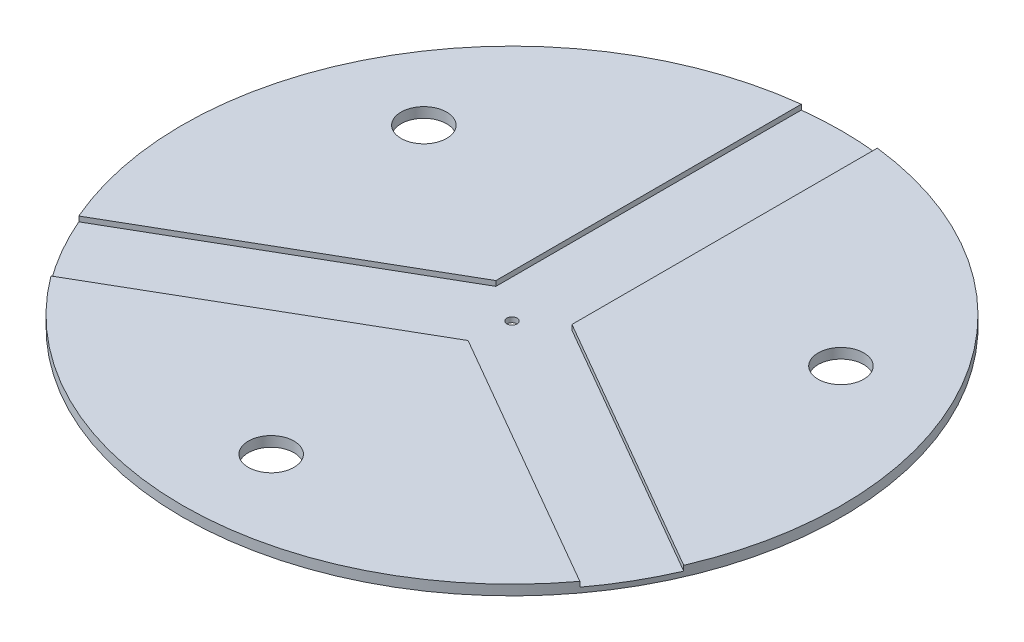
ISO-10303-21;
HEADER;
FILE_DESCRIPTION(('STEP AP214'),'2;1');
FILE_NAME('part.step','',(''),(''),'','','');
FILE_SCHEMA(('AUTOMOTIVE_DESIGN { 1 0 10303 214 1 1 1 1 }'));
ENDSEC;
DATA;
#1=APPLICATION_CONTEXT('core data for automotive mechanical design processes');
#2=APPLICATION_PROTOCOL_DEFINITION('international standard','automotive_design',2000,#1);
#3=PRODUCT_CONTEXT('',#1,'mechanical');
#4=PRODUCT('Part','Part','',(#3));
#5=PRODUCT_RELATED_PRODUCT_CATEGORY('part','',(#4));
#6=PRODUCT_DEFINITION_FORMATION('','',#4);
#7=PRODUCT_DEFINITION_CONTEXT('part definition',#1,'design');
#8=PRODUCT_DEFINITION('design','',#6,#7);
#9=PRODUCT_DEFINITION_SHAPE('','',#8);
#10=(LENGTH_UNIT() NAMED_UNIT(*) SI_UNIT(.MILLI.,.METRE.));
#11=(NAMED_UNIT(*) PLANE_ANGLE_UNIT() SI_UNIT($,.RADIAN.));
#12=(NAMED_UNIT(*) SI_UNIT($,.STERADIAN.) SOLID_ANGLE_UNIT());
#13=UNCERTAINTY_MEASURE_WITH_UNIT(LENGTH_MEASURE(1.E-05),#10,'distance_accuracy_value','');
#14=(GEOMETRIC_REPRESENTATION_CONTEXT(3) GLOBAL_UNCERTAINTY_ASSIGNED_CONTEXT((#13)) GLOBAL_UNIT_ASSIGNED_CONTEXT((#10,
#11,#12)) REPRESENTATION_CONTEXT('',''));
#15=CARTESIAN_POINT('',(0.,0.,0.));
#16=DIRECTION('',(0.,0.,1.));
#17=DIRECTION('',(1.,0.,0.));
#18=AXIS2_PLACEMENT_3D('',#15,#16,#17);
#19=CARTESIAN_POINT('',(0.,1.,0.));
#20=DIRECTION('',(0.,1.,0.));
#21=DIRECTION('',(0.,0.,1.));
#22=AXIS2_PLACEMENT_3D('',#19,#20,#21);
#23=PLANE('',#22);
#24=CARTESIAN_POINT('',(41.1362066797609,1.,-23.7499999999999));
#25=DIRECTION('',(0.,1.,0.));
#26=DIRECTION('',(0.,0.,1.));
#27=AXIS2_PLACEMENT_3D('',#24,#25,#26);
#28=CIRCLE('',#27,4.5);
#29=CARTESIAN_POINT('',(41.1362066797609,1.,-19.2499999999999));
#30=VERTEX_POINT('',#29);
#31=EDGE_CURVE('E146',#30,#30,#28,.T.);
#32=ORIENTED_EDGE('',*,*,#31,.F.);
#33=EDGE_LOOP('',(#32));
#34=FACE_BOUND('',#33,.T.);
#35=DIRECTION('',(0.,0.,-1.));
#36=VECTOR('',#35,1.);
#37=CARTESIAN_POINT('',(7.5,1.,-73.6523444441214));
#38=LINE('',#37,#36);
#39=CARTESIAN_POINT('',(7.50000000000001,1.,-4.33012701892217));
#40=VERTEX_POINT('',#39);
#41=CARTESIAN_POINT('',(7.5,1.,-64.5658578507248));
#42=VERTEX_POINT('',#41);
#43=EDGE_CURVE('E143',#40,#42,#38,.T.);
#44=ORIENTED_EDGE('',*,*,#43,.F.);
#45=DIRECTION('',(-0.866025403784436,0.,-0.500000000000004));
#46=VECTOR('',#45,1.);
#47=CARTESIAN_POINT('',(67.5348013368907,1.,30.3309816936777));
#48=LINE('',#47,#46);
#49=CARTESIAN_POINT('',(59.6656731158625,1.,25.7877383969794));
#50=VERTEX_POINT('',#49);
#51=EDGE_CURVE('E158',#50,#40,#48,.T.);
#52=ORIENTED_EDGE('',*,*,#51,.F.);
#53=CARTESIAN_POINT('',(0.,1.,0.));
#54=DIRECTION('',(0.,1.,0.));
#55=DIRECTION('',(0.,0.,1.));
#56=AXIS2_PLACEMENT_3D('',#53,#54,#55);
#57=CIRCLE('',#56,65.);
#58=EDGE_CURVE('E183',#50,#42,#57,.T.);
#59=ORIENTED_EDGE('',*,*,#58,.T.);
#60=EDGE_LOOP('',(#44,#52,#59));
#61=FACE_BOUND('',#60,.T.);
#62=ADVANCED_FACE('F38',(#34,#61),#23,.T.);
#63=CARTESIAN_POINT('',(2.89815974737969E-12,1.,47.5000000000017));
#64=DIRECTION('',(0.,1.,0.));
#65=DIRECTION('',(0.,0.,1.));
#66=AXIS2_PLACEMENT_3D('',#63,#64,#65);
#67=CIRCLE('',#66,4.49999999999906);
#68=CARTESIAN_POINT('',(2.89815974737969E-12,1.,52.0000000000008));
#69=VERTEX_POINT('',#68);
#70=EDGE_CURVE('E246',#69,#69,#67,.T.);
#71=ORIENTED_EDGE('',*,*,#70,.F.);
#72=EDGE_LOOP('',(#71));
#73=FACE_BOUND('',#72,.T.);
#74=DIRECTION('',(0.866025403784436,0.,0.500000000000004));
#75=VECTOR('',#74,1.);
#76=CARTESIAN_POINT('',(60.0348013368906,1.,43.3213627504443));
#77=LINE('',#76,#75);
#78=CARTESIAN_POINT('',(-1.00613961606655E-13,1.,8.66025403784438));
#79=VERTEX_POINT('',#78);
#80=CARTESIAN_POINT('',(52.1656731158624,1.,38.7781194537459));
#81=VERTEX_POINT('',#80);
#82=EDGE_CURVE('E155',#79,#81,#77,.T.);
#83=ORIENTED_EDGE('',*,*,#82,.F.);
#84=DIRECTION('',(0.866025403784443,0.,-0.499999999999992));
#85=VECTOR('',#84,1.);
#86=CARTESIAN_POINT('',(-60.0348013368912,1.,43.3213627504434));
#87=LINE('',#86,#85);
#88=CARTESIAN_POINT('',(-52.165673115863,1.,38.7781194537452));
#89=VERTEX_POINT('',#88);
#90=EDGE_CURVE('E152',#89,#79,#87,.T.);
#91=ORIENTED_EDGE('',*,*,#90,.F.);
#92=EDGE_CURVE('E178',#89,#81,#57,.T.);
#93=ORIENTED_EDGE('',*,*,#92,.T.);
#94=EDGE_LOOP('',(#83,#91,#93));
#95=FACE_BOUND('',#94,.T.);
#96=ADVANCED_FACE('F214',(#73,#95),#23,.T.);
#97=CARTESIAN_POINT('',(0.,1.,0.));
#98=DIRECTION('',(0.,-1.,0.));
#99=DIRECTION('',(0.,0.,-1.));
#100=AXIS2_PLACEMENT_3D('',#97,#98,#99);
#101=CYLINDRICAL_SURFACE('',#100,1.);
#102=CARTESIAN_POINT('',(0.,-1.,0.));
#103=DIRECTION('',(0.,1.,0.));
#104=DIRECTION('',(0.,0.,1.));
#105=AXIS2_PLACEMENT_3D('',#102,#103,#104);
#106=CIRCLE('',#105,1.);
#107=CARTESIAN_POINT('',(0.,-1.,1.));
#108=VERTEX_POINT('',#107);
#109=EDGE_CURVE('E173',#108,#108,#106,.T.);
#110=ORIENTED_EDGE('',*,*,#109,.F.);
#111=EDGE_LOOP('',(#110));
#112=FACE_BOUND('',#111,.T.);
#113=CARTESIAN_POINT('',(0.,0.,0.));
#114=DIRECTION('',(0.,1.,0.));
#115=DIRECTION('',(0.,0.,1.));
#116=AXIS2_PLACEMENT_3D('',#113,#114,#115);
#117=CIRCLE('',#116,1.);
#118=CARTESIAN_POINT('',(0.,0.,1.));
#119=VERTEX_POINT('',#118);
#120=EDGE_CURVE('E165',#119,#119,#117,.T.);
#121=ORIENTED_EDGE('',*,*,#120,.T.);
#122=EDGE_LOOP('',(#121));
#123=FACE_BOUND('',#122,.T.);
#124=ADVANCED_FACE('F281',(#112,#123),#101,.F.);
#125=CARTESIAN_POINT('',(-41.1362066797608,1.,-23.7499999999966));
#126=DIRECTION('',(0.,1.,0.));
#127=DIRECTION('',(0.,0.,1.));
#128=AXIS2_PLACEMENT_3D('',#125,#126,#127);
#129=CIRCLE('',#128,4.50000000000246);
#130=CARTESIAN_POINT('',(-41.1362066797608,1.,-19.2499999999942));
#131=VERTEX_POINT('',#130);
#132=EDGE_CURVE('E237',#131,#131,#129,.T.);
#133=ORIENTED_EDGE('',*,*,#132,.F.);
#134=EDGE_LOOP('',(#133));
#135=FACE_BOUND('',#134,.T.);
#136=DIRECTION('',(-0.866025403784443,0.,0.499999999999992));
#137=VECTOR('',#136,1.);
#138=CARTESIAN_POINT('',(-67.5348013368911,1.,30.3309816936768));
#139=LINE('',#138,#137);
#140=CARTESIAN_POINT('',(-7.49999999999998,1.,-4.33012701892227));
#141=VERTEX_POINT('',#140);
#142=CARTESIAN_POINT('',(-59.6656731158629,1.,25.7877383969786));
#143=VERTEX_POINT('',#142);
#144=EDGE_CURVE('E149',#141,#143,#139,.T.);
#145=ORIENTED_EDGE('',*,*,#144,.F.);
#146=DIRECTION('',(0.,0.,1.));
#147=VECTOR('',#146,1.);
#148=CARTESIAN_POINT('',(-7.5,1.,-73.6523444441214));
#149=LINE('',#148,#147);
#150=CARTESIAN_POINT('',(-7.5,1.,-64.5658578507248));
#151=VERTEX_POINT('',#150);
#152=EDGE_CURVE('E119',#151,#141,#149,.T.);
#153=ORIENTED_EDGE('',*,*,#152,.F.);
#154=EDGE_CURVE('E182',#151,#143,#57,.T.);
#155=ORIENTED_EDGE('',*,*,#154,.T.);
#156=EDGE_LOOP('',(#145,#153,#155));
#157=FACE_BOUND('',#156,.T.);
#158=ADVANCED_FACE('F224',(#135,#157),#23,.T.);
#159=CARTESIAN_POINT('',(0.,-1.,0.));
#160=DIRECTION('',(0.,1.,0.));
#161=DIRECTION('',(0.,0.,1.));
#162=AXIS2_PLACEMENT_3D('',#159,#160,#161);
#163=PLANE('',#162);
#164=CARTESIAN_POINT('',(41.1362066797609,-1.,-23.7499999999999));
#165=DIRECTION('',(0.,1.,0.));
#166=DIRECTION('',(0.,0.,1.));
#167=AXIS2_PLACEMENT_3D('',#164,#165,#166);
#168=CIRCLE('',#167,4.5);
#169=CARTESIAN_POINT('',(41.1362066797609,-1.,-19.2499999999999));
#170=VERTEX_POINT('',#169);
#171=EDGE_CURVE('E250',#170,#170,#168,.T.);
#172=ORIENTED_EDGE('',*,*,#171,.T.);
#173=EDGE_LOOP('',(#172));
#174=FACE_BOUND('',#173,.T.);
#175=CARTESIAN_POINT('',(2.89815974737969E-12,-1.,47.5000000000017));
#176=DIRECTION('',(0.,1.,0.));
#177=DIRECTION('',(0.,0.,1.));
#178=AXIS2_PLACEMENT_3D('',#175,#176,#177);
#179=CIRCLE('',#178,4.49999999999906);
#180=CARTESIAN_POINT('',(2.89815974737969E-12,-1.,52.0000000000008));
#181=VERTEX_POINT('',#180);
#182=EDGE_CURVE('E241',#181,#181,#179,.T.);
#183=ORIENTED_EDGE('',*,*,#182,.T.);
#184=EDGE_LOOP('',(#183));
#185=FACE_BOUND('',#184,.T.);
#186=CARTESIAN_POINT('',(-41.1362066797608,-1.,-23.7499999999966));
#187=DIRECTION('',(0.,1.,0.));
#188=DIRECTION('',(0.,0.,1.));
#189=AXIS2_PLACEMENT_3D('',#186,#187,#188);
#190=CIRCLE('',#189,4.50000000000246);
#191=CARTESIAN_POINT('',(-41.1362066797608,-1.,-19.2499999999942));
#192=VERTEX_POINT('',#191);
#193=EDGE_CURVE('E242',#192,#192,#190,.T.);
#194=ORIENTED_EDGE('',*,*,#193,.T.);
#195=EDGE_LOOP('',(#194));
#196=FACE_BOUND('',#195,.T.);
#197=CARTESIAN_POINT('',(0.,-1.,0.));
#198=DIRECTION('',(0.,1.,0.));
#199=DIRECTION('',(0.,0.,1.));
#200=AXIS2_PLACEMENT_3D('',#197,#198,#199);
#201=CIRCLE('',#200,65.);
#202=CARTESIAN_POINT('',(0.,-1.,65.));
#203=VERTEX_POINT('',#202);
#204=EDGE_CURVE('E177',#203,#203,#201,.T.);
#205=ORIENTED_EDGE('',*,*,#204,.F.);
#206=EDGE_LOOP('',(#205));
#207=FACE_BOUND('',#206,.T.);
#208=ORIENTED_EDGE('',*,*,#109,.T.);
#209=EDGE_LOOP('',(#208));
#210=FACE_BOUND('',#209,.T.);
#211=ADVANCED_FACE('F261',(#174,#185,#196,#207,#210),#163,.F.);
#212=CARTESIAN_POINT('',(0.,1.,0.));
#213=DIRECTION('',(0.,-1.,0.));
#214=DIRECTION('',(0.,0.,-1.));
#215=AXIS2_PLACEMENT_3D('',#212,#213,#214);
#216=CYLINDRICAL_SURFACE('',#215,65.);
#217=ORIENTED_EDGE('',*,*,#58,.F.);
#218=DIRECTION('',(0.,-1.,0.));
#219=VECTOR('',#218,1.);
#220=CARTESIAN_POINT('',(59.6656731158625,1.,25.7877383969794));
#221=LINE('',#220,#219);
#222=CARTESIAN_POINT('',(59.6656731158625,0.,25.7877383969794));
#223=VERTEX_POINT('',#222);
#224=EDGE_CURVE('E11',#50,#223,#221,.T.);
#225=ORIENTED_EDGE('',*,*,#224,.T.);
#226=CARTESIAN_POINT('',(0.,0.,0.));
#227=DIRECTION('',(0.,1.,0.));
#228=DIRECTION('',(0.,0.,1.));
#229=AXIS2_PLACEMENT_3D('',#226,#227,#228);
#230=CIRCLE('',#229,65.);
#231=CARTESIAN_POINT('',(52.1656731158624,0.,38.7781194537459));
#232=VERTEX_POINT('',#231);
#233=EDGE_CURVE('E172',#232,#223,#230,.T.);
#234=ORIENTED_EDGE('',*,*,#233,.F.);
#235=DIRECTION('',(0.,-1.,0.));
#236=VECTOR('',#235,1.);
#237=CARTESIAN_POINT('',(52.1656731158624,1.,38.7781194537459));
#238=LINE('',#237,#236);
#239=EDGE_CURVE('E47',#232,#81,#238,.F.);
#240=ORIENTED_EDGE('',*,*,#239,.T.);
#241=ORIENTED_EDGE('',*,*,#92,.F.);
#242=DIRECTION('',(0.,-1.,0.));
#243=VECTOR('',#242,1.);
#244=CARTESIAN_POINT('',(-52.165673115863,1.,38.7781194537452));
#245=LINE('',#244,#243);
#246=CARTESIAN_POINT('',(-52.165673115863,0.,38.7781194537452));
#247=VERTEX_POINT('',#246);
#248=EDGE_CURVE('E192',#89,#247,#245,.T.);
#249=ORIENTED_EDGE('',*,*,#248,.T.);
#250=CARTESIAN_POINT('',(-59.6656731158629,0.,25.7877383969786));
#251=VERTEX_POINT('',#250);
#252=EDGE_CURVE('E169',#251,#247,#230,.T.);
#253=ORIENTED_EDGE('',*,*,#252,.F.);
#254=DIRECTION('',(0.,-1.,0.));
#255=VECTOR('',#254,1.);
#256=CARTESIAN_POINT('',(-59.6656731158629,1.,25.7877383969786));
#257=LINE('',#256,#255);
#258=EDGE_CURVE('E128',#251,#143,#257,.F.);
#259=ORIENTED_EDGE('',*,*,#258,.T.);
#260=ORIENTED_EDGE('',*,*,#154,.F.);
#261=DIRECTION('',(0.,-1.,0.));
#262=VECTOR('',#261,1.);
#263=CARTESIAN_POINT('',(-7.5,1.,-64.5658578507248));
#264=LINE('',#263,#262);
#265=CARTESIAN_POINT('',(-7.5,0.,-64.5658578507248));
#266=VERTEX_POINT('',#265);
#267=EDGE_CURVE('E196',#151,#266,#264,.T.);
#268=ORIENTED_EDGE('',*,*,#267,.T.);
#269=CARTESIAN_POINT('',(7.5,0.,-64.5658578507248));
#270=VERTEX_POINT('',#269);
#271=EDGE_CURVE('E60',#270,#266,#230,.T.);
#272=ORIENTED_EDGE('',*,*,#271,.F.);
#273=DIRECTION('',(0.,-1.,0.));
#274=VECTOR('',#273,1.);
#275=CARTESIAN_POINT('',(7.5,1.,-64.5658578507248));
#276=LINE('',#275,#274);
#277=EDGE_CURVE('E199',#270,#42,#276,.F.);
#278=ORIENTED_EDGE('',*,*,#277,.T.);
#279=EDGE_LOOP('',(#217,#225,#234,#240,#241,#249,#253,#259,#260,#268,#272,#278));
#280=FACE_BOUND('',#279,.T.);
#281=ORIENTED_EDGE('',*,*,#204,.T.);
#282=EDGE_LOOP('',(#281));
#283=FACE_BOUND('',#282,.T.);
#284=ADVANCED_FACE('F40',(#280,#283),#216,.T.);
#285=CARTESIAN_POINT('',(7.5,0.,-73.6523444441214));
#286=DIRECTION('',(1.,0.,0.));
#287=DIRECTION('',(0.,0.,-1.));
#288=AXIS2_PLACEMENT_3D('',#285,#286,#287);
#289=PLANE('',#288);
#290=DIRECTION('',(0.,0.,-1.));
#291=VECTOR('',#290,1.);
#292=CARTESIAN_POINT('',(7.5,0.,-73.6523444441214));
#293=LINE('',#292,#291);
#294=CARTESIAN_POINT('',(7.50000000000001,0.,-4.33012701892217));
#295=VERTEX_POINT('',#294);
#296=EDGE_CURVE('E113',#295,#270,#293,.T.);
#297=ORIENTED_EDGE('',*,*,#296,.F.);
#298=DIRECTION('',(0.,1.,0.));
#299=VECTOR('',#298,1.);
#300=CARTESIAN_POINT('',(7.50000000000001,0.,-4.33012701892217));
#301=LINE('',#300,#299);
#302=EDGE_CURVE('E161',#295,#40,#301,.T.);
#303=ORIENTED_EDGE('',*,*,#302,.T.);
#304=ORIENTED_EDGE('',*,*,#43,.T.);
#305=ORIENTED_EDGE('',*,*,#277,.F.);
#306=EDGE_LOOP('',(#297,#303,#304,#305));
#307=FACE_BOUND('',#306,.T.);
#308=ADVANCED_FACE('F233',(#307),#289,.F.);
#309=CARTESIAN_POINT('',(67.5348013368907,0.,30.3309816936777));
#310=DIRECTION('',(0.500000000000004,0.,-0.866025403784436));
#311=DIRECTION('',(-0.866025403784436,0.,-0.500000000000004));
#312=AXIS2_PLACEMENT_3D('',#309,#310,#311);
#313=PLANE('',#312);
#314=ORIENTED_EDGE('',*,*,#51,.T.);
#315=ORIENTED_EDGE('',*,*,#302,.F.);
#316=DIRECTION('',(-0.866025403784436,0.,-0.500000000000004));
#317=VECTOR('',#316,1.);
#318=CARTESIAN_POINT('',(67.5348013368907,0.,30.3309816936777));
#319=LINE('',#318,#317);
#320=EDGE_CURVE('E124',#223,#295,#319,.T.);
#321=ORIENTED_EDGE('',*,*,#320,.F.);
#322=ORIENTED_EDGE('',*,*,#224,.F.);
#323=EDGE_LOOP('',(#314,#315,#321,#322));
#324=FACE_BOUND('',#323,.T.);
#325=ADVANCED_FACE('F313',(#324),#313,.F.);
#326=CARTESIAN_POINT('',(60.0348013368906,0.,43.3213627504443));
#327=DIRECTION('',(-0.500000000000004,0.,0.866025403784436));
#328=DIRECTION('',(0.866025403784436,0.,0.500000000000004));
#329=AXIS2_PLACEMENT_3D('',#326,#327,#328);
#330=PLANE('',#329);
#331=DIRECTION('',(0.866025403784436,0.,0.500000000000004));
#332=VECTOR('',#331,1.);
#333=CARTESIAN_POINT('',(60.0348013368906,0.,43.3213627504443));
#334=LINE('',#333,#332);
#335=CARTESIAN_POINT('',(-1.00613961606655E-13,0.,8.66025403784438));
#336=VERTEX_POINT('',#335);
#337=EDGE_CURVE('E134',#336,#232,#334,.T.);
#338=ORIENTED_EDGE('',*,*,#337,.F.);
#339=DIRECTION('',(0.,1.,0.));
#340=VECTOR('',#339,1.);
#341=CARTESIAN_POINT('',(-1.00613961606655E-13,0.,8.66025403784438));
#342=LINE('',#341,#340);
#343=EDGE_CURVE('E123',#336,#79,#342,.T.);
#344=ORIENTED_EDGE('',*,*,#343,.T.);
#345=ORIENTED_EDGE('',*,*,#82,.T.);
#346=ORIENTED_EDGE('',*,*,#239,.F.);
#347=EDGE_LOOP('',(#338,#344,#345,#346));
#348=FACE_BOUND('',#347,.T.);
#349=ADVANCED_FACE('F219',(#348),#330,.F.);
#350=CARTESIAN_POINT('',(-60.0348013368912,0.,43.3213627504434));
#351=DIRECTION('',(0.499999999999992,0.,0.866025403784443));
#352=DIRECTION('',(0.866025403784443,0.,-0.499999999999992));
#353=AXIS2_PLACEMENT_3D('',#350,#351,#352);
#354=PLANE('',#353);
#355=ORIENTED_EDGE('',*,*,#90,.T.);
#356=ORIENTED_EDGE('',*,*,#343,.F.);
#357=DIRECTION('',(0.866025403784443,0.,-0.499999999999992));
#358=VECTOR('',#357,1.);
#359=CARTESIAN_POINT('',(-60.0348013368912,0.,43.3213627504434));
#360=LINE('',#359,#358);
#361=EDGE_CURVE('E131',#247,#336,#360,.T.);
#362=ORIENTED_EDGE('',*,*,#361,.F.);
#363=ORIENTED_EDGE('',*,*,#248,.F.);
#364=EDGE_LOOP('',(#355,#356,#362,#363));
#365=FACE_BOUND('',#364,.T.);
#366=ADVANCED_FACE('F217',(#365),#354,.F.);
#367=CARTESIAN_POINT('',(-67.5348013368911,0.,30.3309816936768));
#368=DIRECTION('',(-0.499999999999992,0.,-0.866025403784443));
#369=DIRECTION('',(-0.866025403784443,0.,0.499999999999992));
#370=AXIS2_PLACEMENT_3D('',#367,#368,#369);
#371=PLANE('',#370);
#372=DIRECTION('',(-0.866025403784443,0.,0.499999999999992));
#373=VECTOR('',#372,1.);
#374=CARTESIAN_POINT('',(-67.5348013368911,0.,30.3309816936768));
#375=LINE('',#374,#373);
#376=CARTESIAN_POINT('',(-7.49999999999998,0.,-4.33012701892227));
#377=VERTEX_POINT('',#376);
#378=EDGE_CURVE('E54',#377,#251,#375,.T.);
#379=ORIENTED_EDGE('',*,*,#378,.F.);
#380=DIRECTION('',(0.,1.,0.));
#381=VECTOR('',#380,1.);
#382=CARTESIAN_POINT('',(-7.49999999999998,0.,-4.33012701892227));
#383=LINE('',#382,#381);
#384=EDGE_CURVE('E116',#377,#141,#383,.T.);
#385=ORIENTED_EDGE('',*,*,#384,.T.);
#386=ORIENTED_EDGE('',*,*,#144,.T.);
#387=ORIENTED_EDGE('',*,*,#258,.F.);
#388=EDGE_LOOP('',(#379,#385,#386,#387));
#389=FACE_BOUND('',#388,.T.);
#390=ADVANCED_FACE('F126',(#389),#371,.F.);
#391=CARTESIAN_POINT('',(-7.5,0.,-73.6523444441214));
#392=DIRECTION('',(-1.,0.,0.));
#393=DIRECTION('',(0.,0.,1.));
#394=AXIS2_PLACEMENT_3D('',#391,#392,#393);
#395=PLANE('',#394);
#396=ORIENTED_EDGE('',*,*,#152,.T.);
#397=ORIENTED_EDGE('',*,*,#384,.F.);
#398=DIRECTION('',(0.,0.,1.));
#399=VECTOR('',#398,1.);
#400=CARTESIAN_POINT('',(-7.5,0.,-73.6523444441214));
#401=LINE('',#400,#399);
#402=EDGE_CURVE('E107',#266,#377,#401,.T.);
#403=ORIENTED_EDGE('',*,*,#402,.F.);
#404=ORIENTED_EDGE('',*,*,#267,.F.);
#405=EDGE_LOOP('',(#396,#397,#403,#404));
#406=FACE_BOUND('',#405,.T.);
#407=ADVANCED_FACE('F117',(#406),#395,.F.);
#408=CARTESIAN_POINT('',(0.,0.,0.));
#409=DIRECTION('',(0.,1.,0.));
#410=DIRECTION('',(0.,0.,1.));
#411=AXIS2_PLACEMENT_3D('',#408,#409,#410);
#412=PLANE('',#411);
#413=ORIENTED_EDGE('',*,*,#120,.F.);
#414=EDGE_LOOP('',(#413));
#415=FACE_BOUND('',#414,.T.);
#416=ORIENTED_EDGE('',*,*,#233,.T.);
#417=ORIENTED_EDGE('',*,*,#320,.T.);
#418=ORIENTED_EDGE('',*,*,#296,.T.);
#419=ORIENTED_EDGE('',*,*,#271,.T.);
#420=ORIENTED_EDGE('',*,*,#402,.T.);
#421=ORIENTED_EDGE('',*,*,#378,.T.);
#422=ORIENTED_EDGE('',*,*,#252,.T.);
#423=ORIENTED_EDGE('',*,*,#361,.T.);
#424=ORIENTED_EDGE('',*,*,#337,.T.);
#425=EDGE_LOOP('',(#416,#417,#418,#419,#420,#421,#422,#423,#424));
#426=FACE_BOUND('',#425,.T.);
#427=ADVANCED_FACE('F109',(#415,#426),#412,.T.);
#428=CARTESIAN_POINT('',(-41.1362066797608,1.,-23.7499999999966));
#429=DIRECTION('',(0.,-1.,0.));
#430=DIRECTION('',(0.,0.,-1.));
#431=AXIS2_PLACEMENT_3D('',#428,#429,#430);
#432=CYLINDRICAL_SURFACE('',#431,4.50000000000246);
#433=ORIENTED_EDGE('',*,*,#132,.T.);
#434=EDGE_LOOP('',(#433));
#435=FACE_BOUND('',#434,.T.);
#436=ORIENTED_EDGE('',*,*,#193,.F.);
#437=EDGE_LOOP('',(#436));
#438=FACE_BOUND('',#437,.T.);
#439=ADVANCED_FACE('F272',(#435,#438),#432,.F.);
#440=CARTESIAN_POINT('',(2.89815974737969E-12,1.,47.5000000000017));
#441=DIRECTION('',(0.,-1.,0.));
#442=DIRECTION('',(0.,0.,-1.));
#443=AXIS2_PLACEMENT_3D('',#440,#441,#442);
#444=CYLINDRICAL_SURFACE('',#443,4.49999999999906);
#445=ORIENTED_EDGE('',*,*,#70,.T.);
#446=EDGE_LOOP('',(#445));
#447=FACE_BOUND('',#446,.T.);
#448=ORIENTED_EDGE('',*,*,#182,.F.);
#449=EDGE_LOOP('',(#448));
#450=FACE_BOUND('',#449,.T.);
#451=ADVANCED_FACE('F266',(#447,#450),#444,.F.);
#452=CARTESIAN_POINT('',(41.1362066797609,1.,-23.7499999999999));
#453=DIRECTION('',(0.,-1.,0.));
#454=DIRECTION('',(0.,0.,-1.));
#455=AXIS2_PLACEMENT_3D('',#452,#453,#454);
#456=CYLINDRICAL_SURFACE('',#455,4.5);
#457=ORIENTED_EDGE('',*,*,#31,.T.);
#458=EDGE_LOOP('',(#457));
#459=FACE_BOUND('',#458,.T.);
#460=ORIENTED_EDGE('',*,*,#171,.F.);
#461=EDGE_LOOP('',(#460));
#462=FACE_BOUND('',#461,.T.);
#463=ADVANCED_FACE('F264',(#459,#462),#456,.F.);
#464=CLOSED_SHELL('',(#62,#96,#124,#158,#211,#284,#308,#325,#349,#366,#390,#407,#427,#439,#451,#463));
#465=MANIFOLD_SOLID_BREP('B2',#464);
#466=ADVANCED_BREP_SHAPE_REPRESENTATION('',(#18,#465),#14);
#467=SHAPE_DEFINITION_REPRESENTATION(#9,#466);
ENDSEC;
END-ISO-10303-21;
